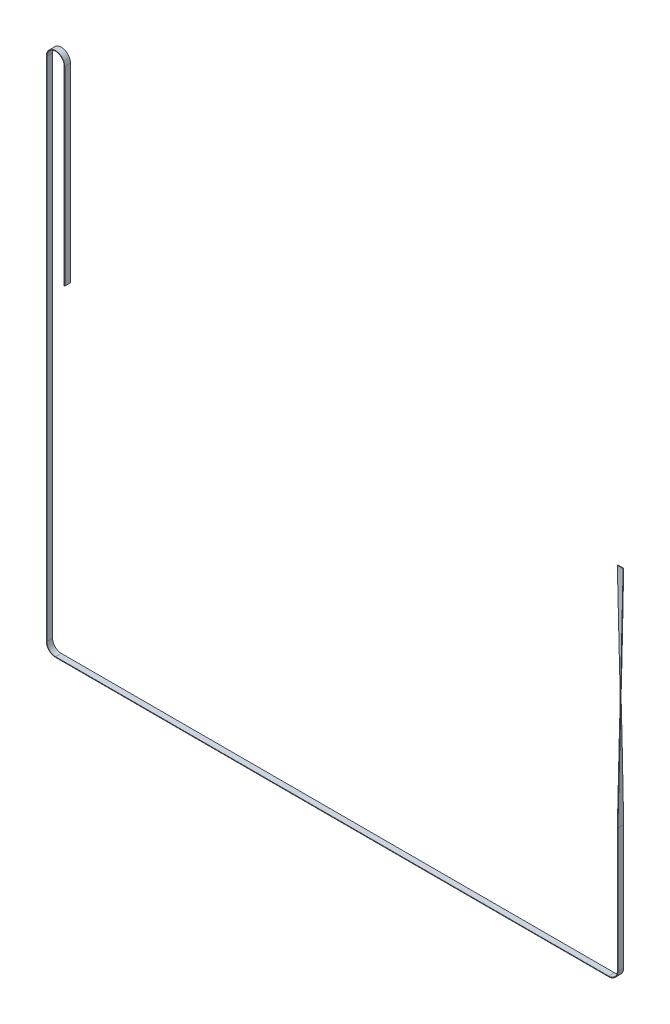
ISO-10303-21;
HEADER;
FILE_DESCRIPTION(('STEP AP214'),'2;1');
FILE_NAME('part.step','',(''),(''),'','','');
FILE_SCHEMA(('AUTOMOTIVE_DESIGN { 1 0 10303 214 1 1 1 1 }'));
ENDSEC;
DATA;
#1=APPLICATION_CONTEXT('core data for automotive mechanical design processes');
#2=APPLICATION_PROTOCOL_DEFINITION('international standard','automotive_design',2000,#1);
#3=PRODUCT_CONTEXT('',#1,'mechanical');
#4=PRODUCT('Part','Part','',(#3));
#5=PRODUCT_RELATED_PRODUCT_CATEGORY('part','',(#4));
#6=PRODUCT_DEFINITION_FORMATION('','',#4);
#7=PRODUCT_DEFINITION_CONTEXT('part definition',#1,'design');
#8=PRODUCT_DEFINITION('design','',#6,#7);
#9=PRODUCT_DEFINITION_SHAPE('','',#8);
#10=(LENGTH_UNIT() NAMED_UNIT(*) SI_UNIT(.MILLI.,.METRE.));
#11=(NAMED_UNIT(*) PLANE_ANGLE_UNIT() SI_UNIT($,.RADIAN.));
#12=(NAMED_UNIT(*) SI_UNIT($,.STERADIAN.) SOLID_ANGLE_UNIT());
#13=UNCERTAINTY_MEASURE_WITH_UNIT(LENGTH_MEASURE(1.E-05),#10,'distance_accuracy_value','');
#14=(GEOMETRIC_REPRESENTATION_CONTEXT(3) GLOBAL_UNCERTAINTY_ASSIGNED_CONTEXT((#13)) GLOBAL_UNIT_ASSIGNED_CONTEXT((#10,
#11,#12)) REPRESENTATION_CONTEXT('',''));
#15=CARTESIAN_POINT('',(0.,0.,0.));
#16=DIRECTION('',(0.,0.,1.));
#17=DIRECTION('',(1.,0.,0.));
#18=AXIS2_PLACEMENT_3D('',#15,#16,#17);
#19=CARTESIAN_POINT('',(-232.5,440.,2.5));
#20=DIRECTION('',(1.,0.,0.));
#21=DIRECTION('',(0.,1.,0.));
#22=AXIS2_PLACEMENT_3D('',#19,#20,#21);
#23=PLANE('',#22);
#24=DIRECTION('',(0.,-1.,0.));
#25=VECTOR('',#24,1.);
#26=CARTESIAN_POINT('',(-232.5,440.,-2.5));
#27=LINE('',#26,#25);
#28=CARTESIAN_POINT('',(-232.5,440.,-2.5));
#29=VERTEX_POINT('',#28);
#30=CARTESIAN_POINT('',(-232.5,275.,-2.5));
#31=VERTEX_POINT('',#30);
#32=EDGE_CURVE('E177',#29,#31,#27,.T.);
#33=ORIENTED_EDGE('',*,*,#32,.T.);
#34=DIRECTION('',(0.,0.,-1.));
#35=VECTOR('',#34,1.);
#36=CARTESIAN_POINT('',(-232.5,275.,2.5));
#37=LINE('',#36,#35);
#38=CARTESIAN_POINT('',(-232.5,275.,2.5));
#39=VERTEX_POINT('',#38);
#40=EDGE_CURVE('E11',#39,#31,#37,.T.);
#41=ORIENTED_EDGE('',*,*,#40,.F.);
#42=DIRECTION('',(0.,-1.,0.));
#43=VECTOR('',#42,1.);
#44=CARTESIAN_POINT('',(-232.5,440.,2.5));
#45=LINE('',#44,#43);
#46=CARTESIAN_POINT('',(-232.5,440.,2.5));
#47=VERTEX_POINT('',#46);
#48=EDGE_CURVE('E111',#47,#39,#45,.T.);
#49=ORIENTED_EDGE('',*,*,#48,.F.);
#50=DIRECTION('',(0.,0.,-1.));
#51=VECTOR('',#50,1.);
#52=CARTESIAN_POINT('',(-232.5,440.,2.5));
#53=LINE('',#52,#51);
#54=EDGE_CURVE('E173',#47,#29,#53,.T.);
#55=ORIENTED_EDGE('',*,*,#54,.T.);
#56=EDGE_LOOP('',(#33,#41,#49,#55));
#57=FACE_BOUND('',#56,.T.);
#58=ADVANCED_FACE('F33',(#57),#23,.F.);
#59=CARTESIAN_POINT('',(-232.,275.,2.5));
#60=DIRECTION('',(0.,-1.,0.));
#61=DIRECTION('',(0.,0.,-1.));
#62=AXIS2_PLACEMENT_3D('',#59,#60,#61);
#63=PLANE('',#62);
#64=DIRECTION('',(-1.,0.,0.));
#65=VECTOR('',#64,1.);
#66=CARTESIAN_POINT('',(-232.,275.,-2.5));
#67=LINE('',#66,#65);
#68=CARTESIAN_POINT('',(-232.,275.,-2.5));
#69=VERTEX_POINT('',#68);
#70=EDGE_CURVE('E180',#69,#31,#67,.T.);
#71=ORIENTED_EDGE('',*,*,#70,.F.);
#72=DIRECTION('',(0.,0.,-1.));
#73=VECTOR('',#72,1.);
#74=CARTESIAN_POINT('',(-232.,275.,2.5));
#75=LINE('',#74,#73);
#76=CARTESIAN_POINT('',(-232.,275.,2.5));
#77=VERTEX_POINT('',#76);
#78=EDGE_CURVE('E41',#77,#69,#75,.T.);
#79=ORIENTED_EDGE('',*,*,#78,.F.);
#80=DIRECTION('',(-1.,0.,0.));
#81=VECTOR('',#80,1.);
#82=CARTESIAN_POINT('',(-232.,275.,2.5));
#83=LINE('',#82,#81);
#84=EDGE_CURVE('E264',#77,#39,#83,.T.);
#85=ORIENTED_EDGE('',*,*,#84,.T.);
#86=ORIENTED_EDGE('',*,*,#40,.T.);
#87=EDGE_LOOP('',(#71,#79,#85,#86));
#88=FACE_BOUND('',#87,.T.);
#89=ADVANCED_FACE('F251',(#88),#63,.T.);
#90=CARTESIAN_POINT('',(-232.,440.,2.5));
#91=DIRECTION('',(1.,0.,0.));
#92=DIRECTION('',(0.,1.,0.));
#93=AXIS2_PLACEMENT_3D('',#90,#91,#92);
#94=PLANE('',#93);
#95=DIRECTION('',(0.,-1.,0.));
#96=VECTOR('',#95,1.);
#97=CARTESIAN_POINT('',(-232.,440.,-2.5));
#98=LINE('',#97,#96);
#99=CARTESIAN_POINT('',(-232.,440.,-2.5));
#100=VERTEX_POINT('',#99);
#101=EDGE_CURVE('E184',#100,#69,#98,.T.);
#102=ORIENTED_EDGE('',*,*,#101,.F.);
#103=DIRECTION('',(0.,0.,-1.));
#104=VECTOR('',#103,1.);
#105=CARTESIAN_POINT('',(-232.,440.,2.5));
#106=LINE('',#105,#104);
#107=CARTESIAN_POINT('',(-232.,440.,2.5));
#108=VERTEX_POINT('',#107);
#109=EDGE_CURVE('E241',#108,#100,#106,.T.);
#110=ORIENTED_EDGE('',*,*,#109,.F.);
#111=DIRECTION('',(0.,-1.,0.));
#112=VECTOR('',#111,1.);
#113=CARTESIAN_POINT('',(-232.,440.,2.5));
#114=LINE('',#113,#112);
#115=EDGE_CURVE('E248',#108,#77,#114,.T.);
#116=ORIENTED_EDGE('',*,*,#115,.T.);
#117=ORIENTED_EDGE('',*,*,#78,.T.);
#118=EDGE_LOOP('',(#102,#110,#116,#117));
#119=FACE_BOUND('',#118,.T.);
#120=ADVANCED_FACE('F246',(#119),#94,.T.);
#121=CARTESIAN_POINT('',(-240.,440.,2.5));
#122=DIRECTION('',(0.,0.,-1.));
#123=DIRECTION('',(-1.,0.,0.));
#124=AXIS2_PLACEMENT_3D('',#121,#122,#123);
#125=CYLINDRICAL_SURFACE('',#124,8.00000000000001);
#126=CARTESIAN_POINT('',(-240.,440.,-2.5));
#127=DIRECTION('',(0.,0.,1.));
#128=DIRECTION('',(1.,0.,0.));
#129=AXIS2_PLACEMENT_3D('',#126,#127,#128);
#130=CIRCLE('',#129,8.00000000000001);
#131=CARTESIAN_POINT('',(-248.,440.,-2.5));
#132=VERTEX_POINT('',#131);
#133=EDGE_CURVE('E187',#132,#100,#130,.F.);
#134=ORIENTED_EDGE('',*,*,#133,.F.);
#135=DIRECTION('',(0.,0.,-1.));
#136=VECTOR('',#135,1.);
#137=CARTESIAN_POINT('',(-248.,440.,2.5));
#138=LINE('',#137,#136);
#139=CARTESIAN_POINT('',(-248.,440.,2.5));
#140=VERTEX_POINT('',#139);
#141=EDGE_CURVE('E239',#140,#132,#138,.T.);
#142=ORIENTED_EDGE('',*,*,#141,.F.);
#143=CARTESIAN_POINT('',(-240.,440.,2.5));
#144=DIRECTION('',(0.,0.,1.));
#145=DIRECTION('',(1.,0.,0.));
#146=AXIS2_PLACEMENT_3D('',#143,#144,#145);
#147=CIRCLE('',#146,8.00000000000001);
#148=EDGE_CURVE('E261',#140,#108,#147,.F.);
#149=ORIENTED_EDGE('',*,*,#148,.T.);
#150=ORIENTED_EDGE('',*,*,#109,.T.);
#151=EDGE_LOOP('',(#134,#142,#149,#150));
#152=FACE_BOUND('',#151,.T.);
#153=ADVANCED_FACE('F258',(#152),#125,.T.);
#154=CARTESIAN_POINT('',(-248.,0.,2.5));
#155=DIRECTION('',(-1.,0.,0.));
#156=DIRECTION('',(0.,0.,1.));
#157=AXIS2_PLACEMENT_3D('',#154,#155,#156);
#158=PLANE('',#157);
#159=DIRECTION('',(0.,1.,0.));
#160=VECTOR('',#159,1.);
#161=CARTESIAN_POINT('',(-248.,0.,-2.5));
#162=LINE('',#161,#160);
#163=CARTESIAN_POINT('',(-248.,0.,-2.5));
#164=VERTEX_POINT('',#163);
#165=EDGE_CURVE('E190',#164,#132,#162,.T.);
#166=ORIENTED_EDGE('',*,*,#165,.F.);
#167=DIRECTION('',(0.,0.,-1.));
#168=VECTOR('',#167,1.);
#169=CARTESIAN_POINT('',(-248.,0.,2.5));
#170=LINE('',#169,#168);
#171=CARTESIAN_POINT('',(-248.,0.,2.5));
#172=VERTEX_POINT('',#171);
#173=EDGE_CURVE('E237',#172,#164,#170,.T.);
#174=ORIENTED_EDGE('',*,*,#173,.F.);
#175=DIRECTION('',(0.,1.,0.));
#176=VECTOR('',#175,1.);
#177=CARTESIAN_POINT('',(-248.,0.,2.5));
#178=LINE('',#177,#176);
#179=EDGE_CURVE('E266',#172,#140,#178,.T.);
#180=ORIENTED_EDGE('',*,*,#179,.T.);
#181=ORIENTED_EDGE('',*,*,#141,.T.);
#182=EDGE_LOOP('',(#166,#174,#180,#181));
#183=FACE_BOUND('',#182,.T.);
#184=ADVANCED_FACE('F322',(#183),#158,.T.);
#185=CARTESIAN_POINT('',(-240.,0.,2.5));
#186=DIRECTION('',(0.,0.,-1.));
#187=DIRECTION('',(-1.,0.,0.));
#188=AXIS2_PLACEMENT_3D('',#185,#186,#187);
#189=CYLINDRICAL_SURFACE('',#188,8.);
#190=CARTESIAN_POINT('',(-240.,0.,-2.5));
#191=DIRECTION('',(0.,0.,1.));
#192=DIRECTION('',(1.,0.,0.));
#193=AXIS2_PLACEMENT_3D('',#190,#191,#192);
#194=CIRCLE('',#193,8.);
#195=CARTESIAN_POINT('',(-240.,-8.00000000000002,-2.5));
#196=VERTEX_POINT('',#195);
#197=EDGE_CURVE('E193',#196,#164,#194,.F.);
#198=ORIENTED_EDGE('',*,*,#197,.F.);
#199=DIRECTION('',(0.,0.,-1.));
#200=VECTOR('',#199,1.);
#201=CARTESIAN_POINT('',(-240.,-8.00000000000002,2.5));
#202=LINE('',#201,#200);
#203=CARTESIAN_POINT('',(-240.,-8.00000000000002,2.5));
#204=VERTEX_POINT('',#203);
#205=EDGE_CURVE('E235',#204,#196,#202,.T.);
#206=ORIENTED_EDGE('',*,*,#205,.F.);
#207=CARTESIAN_POINT('',(-240.,0.,2.5));
#208=DIRECTION('',(0.,0.,1.));
#209=DIRECTION('',(1.,0.,0.));
#210=AXIS2_PLACEMENT_3D('',#207,#208,#209);
#211=CIRCLE('',#210,8.);
#212=EDGE_CURVE('E272',#204,#172,#211,.F.);
#213=ORIENTED_EDGE('',*,*,#212,.T.);
#214=ORIENTED_EDGE('',*,*,#173,.T.);
#215=EDGE_LOOP('',(#198,#206,#213,#214));
#216=FACE_BOUND('',#215,.T.);
#217=ADVANCED_FACE('F325',(#216),#189,.T.);
#218=CARTESIAN_POINT('',(240.,-8.00000000000001,2.5));
#219=DIRECTION('',(0.,-1.,0.));
#220=DIRECTION('',(0.,0.,-1.));
#221=AXIS2_PLACEMENT_3D('',#218,#219,#220);
#222=PLANE('',#221);
#223=DIRECTION('',(1.,0.,0.));
#224=VECTOR('',#223,1.);
#225=CARTESIAN_POINT('',(240.,-8.00000000000001,-2.5));
#226=LINE('',#225,#224);
#227=CARTESIAN_POINT('',(240.,-8.00000000000001,-2.5));
#228=VERTEX_POINT('',#227);
#229=EDGE_CURVE('E196',#228,#196,#226,.F.);
#230=ORIENTED_EDGE('',*,*,#229,.F.);
#231=DIRECTION('',(0.,0.,-1.));
#232=VECTOR('',#231,1.);
#233=CARTESIAN_POINT('',(240.,-8.00000000000001,2.5));
#234=LINE('',#233,#232);
#235=CARTESIAN_POINT('',(240.,-8.00000000000001,2.5));
#236=VERTEX_POINT('',#235);
#237=EDGE_CURVE('E233',#236,#228,#234,.T.);
#238=ORIENTED_EDGE('',*,*,#237,.F.);
#239=DIRECTION('',(1.,0.,0.));
#240=VECTOR('',#239,1.);
#241=CARTESIAN_POINT('',(240.,-8.00000000000001,2.5));
#242=LINE('',#241,#240);
#243=EDGE_CURVE('E275',#236,#204,#242,.F.);
#244=ORIENTED_EDGE('',*,*,#243,.T.);
#245=ORIENTED_EDGE('',*,*,#205,.T.);
#246=EDGE_LOOP('',(#230,#238,#244,#245));
#247=FACE_BOUND('',#246,.T.);
#248=ADVANCED_FACE('F329',(#247),#222,.T.);
#249=CARTESIAN_POINT('',(240.,0.,2.5));
#250=DIRECTION('',(0.,0.,-1.));
#251=DIRECTION('',(-1.,0.,0.));
#252=AXIS2_PLACEMENT_3D('',#249,#250,#251);
#253=CYLINDRICAL_SURFACE('',#252,8.00000000000004);
#254=CARTESIAN_POINT('',(240.,0.,-2.5));
#255=DIRECTION('',(0.,0.,1.));
#256=DIRECTION('',(1.,0.,0.));
#257=AXIS2_PLACEMENT_3D('',#254,#255,#256);
#258=CIRCLE('',#257,8.00000000000004);
#259=CARTESIAN_POINT('',(248.,0.,-2.5));
#260=VERTEX_POINT('',#259);
#261=EDGE_CURVE('E199',#260,#228,#258,.F.);
#262=ORIENTED_EDGE('',*,*,#261,.F.);
#263=DIRECTION('',(0.,0.,-1.));
#264=VECTOR('',#263,1.);
#265=CARTESIAN_POINT('',(248.,0.,2.5));
#266=LINE('',#265,#264);
#267=CARTESIAN_POINT('',(248.,0.,2.5));
#268=VERTEX_POINT('',#267);
#269=EDGE_CURVE('E231',#268,#260,#266,.T.);
#270=ORIENTED_EDGE('',*,*,#269,.F.);
#271=CARTESIAN_POINT('',(240.,0.,2.5));
#272=DIRECTION('',(0.,0.,1.));
#273=DIRECTION('',(1.,0.,0.));
#274=AXIS2_PLACEMENT_3D('',#271,#272,#273);
#275=CIRCLE('',#274,8.00000000000004);
#276=EDGE_CURVE('E278',#268,#236,#275,.F.);
#277=ORIENTED_EDGE('',*,*,#276,.T.);
#278=ORIENTED_EDGE('',*,*,#237,.T.);
#279=EDGE_LOOP('',(#262,#270,#277,#278));
#280=FACE_BOUND('',#279,.T.);
#281=ADVANCED_FACE('F333',(#280),#253,.T.);
#282=CARTESIAN_POINT('',(248.,0.,2.5));
#283=DIRECTION('',(1.,0.,0.));
#284=DIRECTION('',(0.,0.,-1.));
#285=AXIS2_PLACEMENT_3D('',#282,#283,#284);
#286=PLANE('',#285);
#287=DIRECTION('',(0.,1.,0.));
#288=VECTOR('',#287,1.);
#289=CARTESIAN_POINT('',(248.,0.,-2.5));
#290=LINE('',#289,#288);
#291=CARTESIAN_POINT('',(248.,107.723742787329,-2.5));
#292=VERTEX_POINT('',#291);
#293=EDGE_CURVE('E202',#292,#260,#290,.F.);
#294=ORIENTED_EDGE('',*,*,#293,.F.);
#295=DIRECTION('',(0.,0.,-1.));
#296=VECTOR('',#295,1.);
#297=CARTESIAN_POINT('',(248.,107.723742787329,2.5));
#298=LINE('',#297,#296);
#299=CARTESIAN_POINT('',(248.,107.723742787329,2.5));
#300=VERTEX_POINT('',#299);
#301=EDGE_CURVE('E228',#300,#292,#298,.T.);
#302=ORIENTED_EDGE('',*,*,#301,.F.);
#303=DIRECTION('',(0.,1.,0.));
#304=VECTOR('',#303,1.);
#305=CARTESIAN_POINT('',(248.,0.,2.5));
#306=LINE('',#305,#304);
#307=EDGE_CURVE('E281',#300,#268,#306,.F.);
#308=ORIENTED_EDGE('',*,*,#307,.T.);
#309=ORIENTED_EDGE('',*,*,#269,.T.);
#310=EDGE_LOOP('',(#294,#302,#308,#309));
#311=FACE_BOUND('',#310,.T.);
#312=ADVANCED_FACE('F337',(#311),#286,.T.);
#313=CARTESIAN_POINT('',(247.5,0.,2.5));
#314=DIRECTION('',(1.,0.,0.));
#315=DIRECTION('',(0.,0.,-1.));
#316=AXIS2_PLACEMENT_3D('',#313,#314,#315);
#317=PLANE('',#316);
#318=DIRECTION('',(0.,-1.,0.));
#319=VECTOR('',#318,1.);
#320=CARTESIAN_POINT('',(247.5,0.,-2.5));
#321=LINE('',#320,#319);
#322=CARTESIAN_POINT('',(247.5,107.723742787329,-2.5));
#323=VERTEX_POINT('',#322);
#324=CARTESIAN_POINT('',(247.5,0.,-2.5));
#325=VERTEX_POINT('',#324);
#326=EDGE_CURVE('E208',#323,#325,#321,.T.);
#327=ORIENTED_EDGE('',*,*,#326,.T.);
#328=DIRECTION('',(0.,0.,-1.));
#329=VECTOR('',#328,1.);
#330=CARTESIAN_POINT('',(247.5,0.,2.5));
#331=LINE('',#330,#329);
#332=CARTESIAN_POINT('',(247.5,0.,2.5));
#333=VERTEX_POINT('',#332);
#334=EDGE_CURVE('E223',#333,#325,#331,.T.);
#335=ORIENTED_EDGE('',*,*,#334,.F.);
#336=DIRECTION('',(0.,-1.,0.));
#337=VECTOR('',#336,1.);
#338=CARTESIAN_POINT('',(247.5,0.,2.5));
#339=LINE('',#338,#337);
#340=CARTESIAN_POINT('',(247.5,107.723742787329,2.5));
#341=VERTEX_POINT('',#340);
#342=EDGE_CURVE('E287',#341,#333,#339,.T.);
#343=ORIENTED_EDGE('',*,*,#342,.F.);
#344=DIRECTION('',(0.,0.,-1.));
#345=VECTOR('',#344,1.);
#346=CARTESIAN_POINT('',(247.5,107.723742787329,2.5));
#347=LINE('',#346,#345);
#348=EDGE_CURVE('E226',#341,#323,#347,.T.);
#349=ORIENTED_EDGE('',*,*,#348,.T.);
#350=EDGE_LOOP('',(#327,#335,#343,#349));
#351=FACE_BOUND('',#350,.T.);
#352=ADVANCED_FACE('F341',(#351),#317,.F.);
#353=CARTESIAN_POINT('',(240.,0.,2.5));
#354=DIRECTION('',(0.,0.,-1.));
#355=DIRECTION('',(-1.,0.,0.));
#356=AXIS2_PLACEMENT_3D('',#353,#354,#355);
#357=CYLINDRICAL_SURFACE('',#356,7.50000000000004);
#358=CARTESIAN_POINT('',(240.,0.,-2.5));
#359=DIRECTION('',(0.,0.,-1.));
#360=DIRECTION('',(-1.,0.,0.));
#361=AXIS2_PLACEMENT_3D('',#358,#359,#360);
#362=CIRCLE('',#361,7.50000000000004);
#363=CARTESIAN_POINT('',(240.,-7.50000000000001,-2.5));
#364=VERTEX_POINT('',#363);
#365=EDGE_CURVE('E210',#325,#364,#362,.T.);
#366=ORIENTED_EDGE('',*,*,#365,.T.);
#367=DIRECTION('',(0.,0.,-1.));
#368=VECTOR('',#367,1.);
#369=CARTESIAN_POINT('',(240.,-7.50000000000001,2.5));
#370=LINE('',#369,#368);
#371=CARTESIAN_POINT('',(240.,-7.50000000000001,2.5));
#372=VERTEX_POINT('',#371);
#373=EDGE_CURVE('E220',#372,#364,#370,.T.);
#374=ORIENTED_EDGE('',*,*,#373,.F.);
#375=CARTESIAN_POINT('',(240.,0.,2.5));
#376=DIRECTION('',(0.,0.,-1.));
#377=DIRECTION('',(-1.,0.,0.));
#378=AXIS2_PLACEMENT_3D('',#375,#376,#377);
#379=CIRCLE('',#378,7.50000000000004);
#380=EDGE_CURVE('E289',#333,#372,#379,.T.);
#381=ORIENTED_EDGE('',*,*,#380,.F.);
#382=ORIENTED_EDGE('',*,*,#334,.T.);
#383=EDGE_LOOP('',(#366,#374,#381,#382));
#384=FACE_BOUND('',#383,.T.);
#385=ADVANCED_FACE('F295',(#384),#357,.F.);
#386=CARTESIAN_POINT('',(240.,-7.50000000000001,2.5));
#387=DIRECTION('',(0.,-1.,0.));
#388=DIRECTION('',(0.,0.,-1.));
#389=AXIS2_PLACEMENT_3D('',#386,#387,#388);
#390=PLANE('',#389);
#391=DIRECTION('',(-1.,0.,0.));
#392=VECTOR('',#391,1.);
#393=CARTESIAN_POINT('',(240.,-7.50000000000001,-2.5));
#394=LINE('',#393,#392);
#395=CARTESIAN_POINT('',(-240.,-7.50000000000002,-2.5));
#396=VERTEX_POINT('',#395);
#397=EDGE_CURVE('E212',#364,#396,#394,.T.);
#398=ORIENTED_EDGE('',*,*,#397,.T.);
#399=DIRECTION('',(0.,0.,-1.));
#400=VECTOR('',#399,1.);
#401=CARTESIAN_POINT('',(-240.,-7.50000000000002,2.5));
#402=LINE('',#401,#400);
#403=CARTESIAN_POINT('',(-240.,-7.50000000000002,2.5));
#404=VERTEX_POINT('',#403);
#405=EDGE_CURVE('E168',#404,#396,#402,.T.);
#406=ORIENTED_EDGE('',*,*,#405,.F.);
#407=DIRECTION('',(-1.,0.,0.));
#408=VECTOR('',#407,1.);
#409=CARTESIAN_POINT('',(240.,-7.50000000000001,2.5));
#410=LINE('',#409,#408);
#411=EDGE_CURVE('E159',#372,#404,#410,.T.);
#412=ORIENTED_EDGE('',*,*,#411,.F.);
#413=ORIENTED_EDGE('',*,*,#373,.T.);
#414=EDGE_LOOP('',(#398,#406,#412,#413));
#415=FACE_BOUND('',#414,.T.);
#416=ADVANCED_FACE('F299',(#415),#390,.F.);
#417=CARTESIAN_POINT('',(-240.,0.,2.5));
#418=DIRECTION('',(0.,0.,-1.));
#419=DIRECTION('',(-1.,0.,0.));
#420=AXIS2_PLACEMENT_3D('',#417,#418,#419);
#421=CYLINDRICAL_SURFACE('',#420,7.5);
#422=CARTESIAN_POINT('',(-240.,0.,-2.5));
#423=DIRECTION('',(0.,0.,-1.));
#424=DIRECTION('',(1.,0.,0.));
#425=AXIS2_PLACEMENT_3D('',#422,#423,#424);
#426=CIRCLE('',#425,7.5);
#427=CARTESIAN_POINT('',(-247.5,0.,-2.5));
#428=VERTEX_POINT('',#427);
#429=EDGE_CURVE('E167',#396,#428,#426,.T.);
#430=ORIENTED_EDGE('',*,*,#429,.T.);
#431=DIRECTION('',(0.,0.,-1.));
#432=VECTOR('',#431,1.);
#433=CARTESIAN_POINT('',(-247.5,0.,2.5));
#434=LINE('',#433,#432);
#435=CARTESIAN_POINT('',(-247.5,0.,2.5));
#436=VERTEX_POINT('',#435);
#437=EDGE_CURVE('E164',#436,#428,#434,.T.);
#438=ORIENTED_EDGE('',*,*,#437,.F.);
#439=CARTESIAN_POINT('',(-240.,0.,2.5));
#440=DIRECTION('',(0.,0.,-1.));
#441=DIRECTION('',(1.,0.,0.));
#442=AXIS2_PLACEMENT_3D('',#439,#440,#441);
#443=CIRCLE('',#442,7.5);
#444=EDGE_CURVE('E153',#404,#436,#443,.T.);
#445=ORIENTED_EDGE('',*,*,#444,.F.);
#446=ORIENTED_EDGE('',*,*,#405,.T.);
#447=EDGE_LOOP('',(#430,#438,#445,#446));
#448=FACE_BOUND('',#447,.T.);
#449=ADVANCED_FACE('F165',(#448),#421,.F.);
#450=CARTESIAN_POINT('',(-247.5,0.,2.5));
#451=DIRECTION('',(-1.,0.,0.));
#452=DIRECTION('',(0.,0.,1.));
#453=AXIS2_PLACEMENT_3D('',#450,#451,#452);
#454=PLANE('',#453);
#455=DIRECTION('',(0.,1.,0.));
#456=VECTOR('',#455,1.);
#457=CARTESIAN_POINT('',(-247.5,0.,-2.5));
#458=LINE('',#457,#456);
#459=CARTESIAN_POINT('',(-247.5,440.,-2.5));
#460=VERTEX_POINT('',#459);
#461=EDGE_CURVE('E99',#428,#460,#458,.T.);
#462=ORIENTED_EDGE('',*,*,#461,.T.);
#463=DIRECTION('',(0.,0.,-1.));
#464=VECTOR('',#463,1.);
#465=CARTESIAN_POINT('',(-247.5,440.,2.5));
#466=LINE('',#465,#464);
#467=CARTESIAN_POINT('',(-247.5,440.,2.5));
#468=VERTEX_POINT('',#467);
#469=EDGE_CURVE('E169',#468,#460,#466,.T.);
#470=ORIENTED_EDGE('',*,*,#469,.F.);
#471=DIRECTION('',(0.,1.,0.));
#472=VECTOR('',#471,1.);
#473=CARTESIAN_POINT('',(-247.5,0.,2.5));
#474=LINE('',#473,#472);
#475=EDGE_CURVE('E157',#436,#468,#474,.T.);
#476=ORIENTED_EDGE('',*,*,#475,.F.);
#477=ORIENTED_EDGE('',*,*,#437,.T.);
#478=EDGE_LOOP('',(#462,#470,#476,#477));
#479=FACE_BOUND('',#478,.T.);
#480=ADVANCED_FACE('F171',(#479),#454,.F.);
#481=CARTESIAN_POINT('',(-240.,440.,2.5));
#482=DIRECTION('',(0.,0.,-1.));
#483=DIRECTION('',(-1.,0.,0.));
#484=AXIS2_PLACEMENT_3D('',#481,#482,#483);
#485=CYLINDRICAL_SURFACE('',#484,7.50000000000001);
#486=CARTESIAN_POINT('',(-240.,440.,-2.5));
#487=DIRECTION('',(0.,0.,-1.));
#488=DIRECTION('',(1.,0.,0.));
#489=AXIS2_PLACEMENT_3D('',#486,#487,#488);
#490=CIRCLE('',#489,7.50000000000001);
#491=EDGE_CURVE('E105',#460,#29,#490,.T.);
#492=ORIENTED_EDGE('',*,*,#491,.T.);
#493=ORIENTED_EDGE('',*,*,#54,.F.);
#494=CARTESIAN_POINT('',(-240.,440.,2.5));
#495=DIRECTION('',(0.,0.,-1.));
#496=DIRECTION('',(1.,0.,0.));
#497=AXIS2_PLACEMENT_3D('',#494,#495,#496);
#498=CIRCLE('',#497,7.50000000000001);
#499=EDGE_CURVE('E49',#468,#47,#498,.T.);
#500=ORIENTED_EDGE('',*,*,#499,.F.);
#501=ORIENTED_EDGE('',*,*,#469,.T.);
#502=EDGE_LOOP('',(#492,#493,#500,#501));
#503=FACE_BOUND('',#502,.T.);
#504=ADVANCED_FACE('F301',(#503),#485,.F.);
#505=CARTESIAN_POINT('',(-240.,440.,2.5));
#506=DIRECTION('',(0.,0.,1.));
#507=DIRECTION('',(1.,0.,0.));
#508=AXIS2_PLACEMENT_3D('',#505,#506,#507);
#509=PLANE('',#508);
#510=ORIENTED_EDGE('',*,*,#48,.T.);
#511=ORIENTED_EDGE('',*,*,#84,.F.);
#512=ORIENTED_EDGE('',*,*,#115,.F.);
#513=ORIENTED_EDGE('',*,*,#148,.F.);
#514=ORIENTED_EDGE('',*,*,#179,.F.);
#515=ORIENTED_EDGE('',*,*,#212,.F.);
#516=ORIENTED_EDGE('',*,*,#243,.F.);
#517=ORIENTED_EDGE('',*,*,#276,.F.);
#518=ORIENTED_EDGE('',*,*,#307,.F.);
#519=DIRECTION('',(1.,0.,0.));
#520=VECTOR('',#519,1.);
#521=CARTESIAN_POINT('',(247.5,107.723742787329,2.5));
#522=LINE('',#521,#520);
#523=EDGE_CURVE('E284',#341,#300,#522,.T.);
#524=ORIENTED_EDGE('',*,*,#523,.F.);
#525=ORIENTED_EDGE('',*,*,#342,.T.);
#526=ORIENTED_EDGE('',*,*,#380,.T.);
#527=ORIENTED_EDGE('',*,*,#411,.T.);
#528=ORIENTED_EDGE('',*,*,#444,.T.);
#529=ORIENTED_EDGE('',*,*,#475,.T.);
#530=ORIENTED_EDGE('',*,*,#499,.T.);
#531=EDGE_LOOP('',(#510,#511,#512,#513,#514,#515,#516,#517,#518,#524,#525,#526,#527,#528,#529,#530));
#532=FACE_BOUND('',#531,.T.);
#533=ADVANCED_FACE('F155',(#532),#509,.T.);
#534=CARTESIAN_POINT('',(-240.,440.,-2.5));
#535=DIRECTION('',(0.,0.,1.));
#536=DIRECTION('',(1.,0.,0.));
#537=AXIS2_PLACEMENT_3D('',#534,#535,#536);
#538=PLANE('',#537);
#539=ORIENTED_EDGE('',*,*,#32,.F.);
#540=ORIENTED_EDGE('',*,*,#491,.F.);
#541=ORIENTED_EDGE('',*,*,#461,.F.);
#542=ORIENTED_EDGE('',*,*,#429,.F.);
#543=ORIENTED_EDGE('',*,*,#397,.F.);
#544=ORIENTED_EDGE('',*,*,#365,.F.);
#545=ORIENTED_EDGE('',*,*,#326,.F.);
#546=DIRECTION('',(1.,0.,0.));
#547=VECTOR('',#546,1.);
#548=CARTESIAN_POINT('',(247.5,107.723742787329,-2.5));
#549=LINE('',#548,#547);
#550=EDGE_CURVE('E205',#323,#292,#549,.T.);
#551=ORIENTED_EDGE('',*,*,#550,.T.);
#552=ORIENTED_EDGE('',*,*,#293,.T.);
#553=ORIENTED_EDGE('',*,*,#261,.T.);
#554=ORIENTED_EDGE('',*,*,#229,.T.);
#555=ORIENTED_EDGE('',*,*,#197,.T.);
#556=ORIENTED_EDGE('',*,*,#165,.T.);
#557=ORIENTED_EDGE('',*,*,#133,.T.);
#558=ORIENTED_EDGE('',*,*,#101,.T.);
#559=ORIENTED_EDGE('',*,*,#70,.T.);
#560=EDGE_LOOP('',(#539,#540,#541,#542,#543,#544,#545,#551,#552,#553,#554,#555,#556,#557,#558,#559));
#561=FACE_BOUND('',#560,.T.);
#562=ADVANCED_FACE('F254',(#561),#538,.F.);
#563=CARTESIAN_POINT('',(245.,302.459613800316,-0.5));
#564=DIRECTION('',(0.,1.,0.));
#565=DIRECTION('',(1.,0.,0.));
#566=AXIS2_PLACEMENT_3D('',#563,#564,#565);
#567=PLANE('',#566);
#568=DIRECTION('',(-1.,0.,0.));
#569=VECTOR('',#568,1.);
#570=CARTESIAN_POINT('',(250.,302.459613800316,-0.5));
#571=LINE('',#570,#569);
#572=CARTESIAN_POINT('',(250.,302.459613800316,-0.5));
#573=VERTEX_POINT('',#572);
#574=CARTESIAN_POINT('',(245.,302.459613800316,-0.499999999999995));
#575=VERTEX_POINT('',#574);
#576=EDGE_CURVE('E480',#573,#575,#571,.T.);
#577=ORIENTED_EDGE('',*,*,#576,.T.);
#578=DIRECTION('',(0.,0.,1.));
#579=VECTOR('',#578,1.);
#580=CARTESIAN_POINT('',(245.,302.459613800316,-0.5));
#581=LINE('',#580,#579);
#582=CARTESIAN_POINT('',(245.,302.459613800316,0.));
#583=VERTEX_POINT('',#582);
#584=EDGE_CURVE('E478',#575,#583,#581,.T.);
#585=ORIENTED_EDGE('',*,*,#584,.T.);
#586=DIRECTION('',(1.,0.,0.));
#587=VECTOR('',#586,1.);
#588=CARTESIAN_POINT('',(245.,302.459613800316,0.));
#589=LINE('',#588,#587);
#590=CARTESIAN_POINT('',(250.,302.459613800316,0.));
#591=VERTEX_POINT('',#590);
#592=EDGE_CURVE('E490',#583,#591,#589,.T.);
#593=ORIENTED_EDGE('',*,*,#592,.T.);
#594=DIRECTION('',(0.,0.,-1.));
#595=VECTOR('',#594,1.);
#596=CARTESIAN_POINT('',(250.,302.459613800316,0.));
#597=LINE('',#596,#595);
#598=EDGE_CURVE('E181',#591,#573,#597,.T.);
#599=ORIENTED_EDGE('',*,*,#598,.T.);
#600=EDGE_LOOP('',(#577,#585,#593,#599));
#601=FACE_BOUND('',#600,.T.);
#602=ADVANCED_FACE('F392',(#601),#567,.T.);
#603=CARTESIAN_POINT('',(248.,107.723742787329,2.5));
#604=CARTESIAN_POINT('',(248.246228508393,119.89473472564,2.45075429832142));
#605=CARTESIAN_POINT('',(248.478118445242,132.065726663952,2.35441804000001));
#606=CARTESIAN_POINT('',(248.710008382091,144.236718602264,2.25808178167861));
#607=CARTESIAN_POINT('',(248.918648347168,156.407710540575,2.11835711509567));
#608=CARTESIAN_POINT('',(249.127288312246,168.578702478887,1.97863244851274));
#609=CARTESIAN_POINT('',(249.3046603887,180.749694417199,1.80088891424656));
#610=CARTESIAN_POINT('',(249.482032465155,192.92068635551,1.62314537998039));
#611=CARTESIAN_POINT('',(249.62132034356,205.091678293822,1.41421356237309));
#612=CARTESIAN_POINT('',(249.760608221965,217.262670232134,1.2052817447658));
#613=CARTESIAN_POINT('',(249.856459147266,229.433662170445,0.973190776397733));
#614=CARTESIAN_POINT('',(249.952310072568,241.604654108757,0.741099808029662));
#615=CARTESIAN_POINT('',(250.001040547461,253.775646047069,0.494768814657081));
#616=CARTESIAN_POINT('',(250.049771022354,265.946637985381,0.2484378212845));
#617=CARTESIAN_POINT('',(250.049508362016,278.117629923692,-0.00266683516129469));
#618=CARTESIAN_POINT('',(250.049245701679,290.288621862004,-0.253771491607089));
#619=CARTESIAN_POINT('',(250.,302.459613800316,-0.5));
#620=CARTESIAN_POINT('',(248.,107.723742787329,-2.5));
#621=CARTESIAN_POINT('',(247.753771491607,119.89473472564,-2.54924570167858));
#622=CARTESIAN_POINT('',(247.502666835161,132.065726663952,-2.54950836201614));
#623=CARTESIAN_POINT('',(247.251562178715,144.236718602264,-2.5497710223537));
#624=CARTESIAN_POINT('',(247.005231185343,156.407710540575,-2.50104054746076));
#625=CARTESIAN_POINT('',(246.75890019197,168.578702478887,-2.45231007256783));
#626=CARTESIAN_POINT('',(246.526809223602,180.749694417199,-2.35645914726616));
#627=CARTESIAN_POINT('',(246.294718255234,192.92068635551,-2.2606082219645));
#628=CARTESIAN_POINT('',(246.085786437627,205.091678293822,-2.12132034355964));
#629=CARTESIAN_POINT('',(245.87685462002,217.262670232134,-1.98203246515478));
#630=CARTESIAN_POINT('',(245.699111085753,229.433662170445,-1.80466038870028));
#631=CARTESIAN_POINT('',(245.521367551487,241.604654108757,-1.62728831224578));
#632=CARTESIAN_POINT('',(245.381642884904,253.775646047069,-1.41864834716837));
#633=CARTESIAN_POINT('',(245.241918218321,265.946637985381,-1.21000838209096));
#634=CARTESIAN_POINT('',(245.14558196,278.117629923692,-0.978118445241936));
#635=CARTESIAN_POINT('',(245.049245701679,290.288621862004,-0.746228508392911));
#636=CARTESIAN_POINT('',(245.,302.459613800316,-0.5));
#637=(BOUNDED_SURFACE() B_SPLINE_SURFACE(1,2,((#603,#604,#605,#606,#607,#608,#609,#610,#611,
#612,#613,#614,#615,#616,#617,#618,#619),(#620,#621,#622,#623,#624,#625,#626,#627,#628,#629,
#630,#631,#632,#633,#634,#635,#636)),.UNSPECIFIED.,.F.,.F.,.F.) B_SPLINE_SURFACE_WITH_KNOTS((2,
2),(3,2,2,2,2,2,2,2,3),(0.,1.),(0.,0.125,0.25,0.375,0.5,0.625,0.75,0.875,1.),
.UNSPECIFIED.) GEOMETRIC_REPRESENTATION_ITEM() RATIONAL_B_SPLINE_SURFACE(((1.,0.995184726672197,
1.,0.995184726672197,1.,0.995184726672197,1.,0.995184726672197,1.,0.995184726672197,1.,
0.995184726672197,1.,0.995184726672197,1.,0.995184726672197,1.),(1.,0.995184726672197,1.,
0.995184726672197,1.,0.995184726672197,1.,0.995184726672197,1.,0.995184726672197,1.,
0.995184726672197,1.,0.995184726672197,1.,0.995184726672197,1.))) REPRESENTATION_ITEM('') SURFACE());
#638=CARTESIAN_POINT('',(248.,107.723742787329,-2.5));
#639=CARTESIAN_POINT('',(247.753771491607,119.89473472564,-2.54924570167858));
#640=CARTESIAN_POINT('',(247.502666835161,132.065726663952,-2.54950836201614));
#641=CARTESIAN_POINT('',(247.251562178715,144.236718602264,-2.5497710223537));
#642=CARTESIAN_POINT('',(247.005231185343,156.407710540575,-2.50104054746076));
#643=CARTESIAN_POINT('',(246.75890019197,168.578702478887,-2.45231007256783));
#644=CARTESIAN_POINT('',(246.526809223602,180.749694417199,-2.35645914726616));
#645=CARTESIAN_POINT('',(246.294718255234,192.92068635551,-2.2606082219645));
#646=CARTESIAN_POINT('',(246.085786437627,205.091678293822,-2.12132034355964));
#647=CARTESIAN_POINT('',(245.87685462002,217.262670232134,-1.98203246515478));
#648=CARTESIAN_POINT('',(245.699111085753,229.433662170445,-1.80466038870028));
#649=CARTESIAN_POINT('',(245.521367551487,241.604654108757,-1.62728831224578));
#650=CARTESIAN_POINT('',(245.381642884904,253.775646047069,-1.41864834716837));
#651=CARTESIAN_POINT('',(245.241918218321,265.946637985381,-1.21000838209096));
#652=CARTESIAN_POINT('',(245.14558196,278.117629923692,-0.978118445241936));
#653=CARTESIAN_POINT('',(245.049245701679,290.288621862004,-0.746228508392911));
#654=CARTESIAN_POINT('',(245.,302.459613800316,-0.5));
#655=(BOUNDED_CURVE() B_SPLINE_CURVE(2,(#638,#639,#640,#641,#642,#643,#644,#645,#646,#647,#648,
#649,#650,#651,#652,#653,#654),.UNSPECIFIED.,.F.,.F.) B_SPLINE_CURVE_WITH_KNOTS((3,2,2,2,2,2,2,
2,3),(0.,0.125,0.25,0.375,0.5,0.625,0.75,0.875,1.),
.UNSPECIFIED.) CURVE() GEOMETRIC_REPRESENTATION_ITEM() RATIONAL_B_SPLINE_CURVE((1.,
0.995184726672197,1.,0.995184726672197,1.,0.995184726672197,1.,0.995184726672197,1.,
0.995184726672197,1.,0.995184726672197,1.,0.995184726672197,1.,0.995184726672197,1.)) REPRESENTATION_ITEM(''));
#656=EDGE_CURVE('E483',#292,#575,#655,.T.);
#657=CARTESIAN_POINT('',(248.,107.723742787329,2.5));
#658=CARTESIAN_POINT('',(248.246228508393,119.89473472564,2.45075429832142));
#659=CARTESIAN_POINT('',(248.478118445242,132.065726663952,2.35441804000001));
#660=CARTESIAN_POINT('',(248.710008382091,144.236718602264,2.25808178167861));
#661=CARTESIAN_POINT('',(248.918648347168,156.407710540575,2.11835711509567));
#662=CARTESIAN_POINT('',(249.127288312246,168.578702478887,1.97863244851274));
#663=CARTESIAN_POINT('',(249.3046603887,180.749694417199,1.80088891424656));
#664=CARTESIAN_POINT('',(249.482032465155,192.92068635551,1.62314537998039));
#665=CARTESIAN_POINT('',(249.62132034356,205.091678293822,1.41421356237309));
#666=CARTESIAN_POINT('',(249.760608221965,217.262670232134,1.2052817447658));
#667=CARTESIAN_POINT('',(249.856459147266,229.433662170445,0.973190776397733));
#668=CARTESIAN_POINT('',(249.952310072568,241.604654108757,0.741099808029662));
#669=CARTESIAN_POINT('',(250.001040547461,253.775646047069,0.494768814657081));
#670=CARTESIAN_POINT('',(250.049771022354,265.946637985381,0.2484378212845));
#671=CARTESIAN_POINT('',(250.049508362016,278.117629923692,-0.00266683516129469));
#672=CARTESIAN_POINT('',(250.049245701679,290.288621862004,-0.253771491607089));
#673=CARTESIAN_POINT('',(250.,302.459613800316,-0.5));
#674=(BOUNDED_CURVE() B_SPLINE_CURVE(2,(#657,#658,#659,#660,#661,#662,#663,#664,#665,#666,#667,
#668,#669,#670,#671,#672,#673),.UNSPECIFIED.,.F.,.F.) B_SPLINE_CURVE_WITH_KNOTS((3,2,2,2,2,2,2,
2,3),(0.,0.125,0.25,0.375,0.5,0.625,0.75,0.875,1.),
.UNSPECIFIED.) CURVE() GEOMETRIC_REPRESENTATION_ITEM() RATIONAL_B_SPLINE_CURVE((1.,
0.995184726672197,1.,0.995184726672197,1.,0.995184726672197,1.,0.995184726672197,1.,
0.995184726672197,1.,0.995184726672197,1.,0.995184726672197,1.,0.995184726672197,1.)) REPRESENTATION_ITEM(''));
#675=EDGE_CURVE('E484',#300,#573,#674,.T.);
#676=ORIENTED_EDGE('',*,*,#656,.T.);
#677=ORIENTED_EDGE('',*,*,#576,.F.);
#678=ORIENTED_EDGE('',*,*,#675,.F.);
#679=ORIENTED_EDGE('',*,*,#301,.T.);
#680=EDGE_LOOP('',(#676,#677,#678,#679));
#681=FACE_BOUND('',#680,.T.);
#682=ADVANCED_FACE('F401',(#681),#637,.T.);
#683=CARTESIAN_POINT('',(248.,107.723742787329,-2.5));
#684=CARTESIAN_POINT('',(247.753771491607,119.89473472564,-2.54924570167858));
#685=CARTESIAN_POINT('',(247.502666835161,132.065726663952,-2.54950836201614));
#686=CARTESIAN_POINT('',(247.251562178715,144.236718602264,-2.5497710223537));
#687=CARTESIAN_POINT('',(247.005231185343,156.407710540575,-2.50104054746076));
#688=CARTESIAN_POINT('',(246.75890019197,168.578702478887,-2.45231007256783));
#689=CARTESIAN_POINT('',(246.526809223602,180.749694417199,-2.35645914726616));
#690=CARTESIAN_POINT('',(246.294718255234,192.92068635551,-2.2606082219645));
#691=CARTESIAN_POINT('',(246.085786437627,205.091678293822,-2.12132034355964));
#692=CARTESIAN_POINT('',(245.87685462002,217.262670232134,-1.98203246515478));
#693=CARTESIAN_POINT('',(245.699111085753,229.433662170445,-1.80466038870028));
#694=CARTESIAN_POINT('',(245.521367551487,241.604654108757,-1.62728831224578));
#695=CARTESIAN_POINT('',(245.381642884904,253.775646047069,-1.41864834716837));
#696=CARTESIAN_POINT('',(245.241918218321,265.946637985381,-1.21000838209096));
#697=CARTESIAN_POINT('',(245.14558196,278.117629923692,-0.978118445241936));
#698=CARTESIAN_POINT('',(245.049245701679,290.288621862004,-0.746228508392911));
#699=CARTESIAN_POINT('',(245.,302.459613800316,-0.5));
#700=CARTESIAN_POINT('',(247.5,107.723742787329,-2.5));
#701=CARTESIAN_POINT('',(247.253771491607,119.89473472564,-2.5));
#702=CARTESIAN_POINT('',(247.01227419496,132.065726663952,-2.45196320100808));
#703=CARTESIAN_POINT('',(246.770776898312,144.236718602264,-2.40392640201615));
#704=CARTESIAN_POINT('',(246.543291419087,156.407710540575,-2.30969883127822));
#705=CARTESIAN_POINT('',(246.315805939862,168.578702478887,-2.21547126054028));
#706=CARTESIAN_POINT('',(246.111074417451,180.749694417199,-2.07867403075636));
#707=CARTESIAN_POINT('',(245.90634289504,192.92068635551,-1.94187680097244));
#708=CARTESIAN_POINT('',(245.732233047034,205.091678293822,-1.76776695296637));
#709=CARTESIAN_POINT('',(245.558123199028,217.262670232134,-1.59365710496029));
#710=CARTESIAN_POINT('',(245.421325969244,229.433662170445,-1.38892558254901));
#711=CARTESIAN_POINT('',(245.28452873946,241.604654108757,-1.18419406013772));
#712=CARTESIAN_POINT('',(245.190301168722,253.775646047069,-0.956708580912725));
#713=CARTESIAN_POINT('',(245.096073597984,265.946637985381,-0.729223101687731));
#714=CARTESIAN_POINT('',(245.048036798992,278.117629923692,-0.487725805040321));
#715=CARTESIAN_POINT('',(245.,290.288621862004,-0.246228508392911));
#716=CARTESIAN_POINT('',(245.,302.459613800316,0.));
#717=(BOUNDED_SURFACE() B_SPLINE_SURFACE(1,2,((#683,#684,#685,#686,#687,#688,#689,#690,#691,
#692,#693,#694,#695,#696,#697,#698,#699),(#700,#701,#702,#703,#704,#705,#706,#707,#708,#709,
#710,#711,#712,#713,#714,#715,#716)),.UNSPECIFIED.,.F.,.F.,.F.) B_SPLINE_SURFACE_WITH_KNOTS((2,
2),(3,2,2,2,2,2,2,2,3),(0.,1.),(0.,0.125,0.25,0.375,0.5,0.625,0.75,0.875,1.),
.UNSPECIFIED.) GEOMETRIC_REPRESENTATION_ITEM() RATIONAL_B_SPLINE_SURFACE(((1.,0.995184726672197,
1.,0.995184726672197,1.,0.995184726672197,1.,0.995184726672197,1.,0.995184726672197,1.,
0.995184726672197,1.,0.995184726672197,1.,0.995184726672197,1.),(1.,0.995184726672197,1.,
0.995184726672197,1.,0.995184726672197,1.,0.995184726672197,1.,0.995184726672197,1.,
0.995184726672197,1.,0.995184726672197,1.,0.995184726672197,1.))) REPRESENTATION_ITEM('') SURFACE());
#718=CARTESIAN_POINT('',(247.5,107.723742787329,-2.5));
#719=CARTESIAN_POINT('',(247.253771491607,119.89473472564,-2.5));
#720=CARTESIAN_POINT('',(247.01227419496,132.065726663952,-2.45196320100808));
#721=CARTESIAN_POINT('',(246.770776898312,144.236718602264,-2.40392640201615));
#722=CARTESIAN_POINT('',(246.543291419087,156.407710540575,-2.30969883127822));
#723=CARTESIAN_POINT('',(246.315805939862,168.578702478887,-2.21547126054028));
#724=CARTESIAN_POINT('',(246.111074417451,180.749694417199,-2.07867403075636));
#725=CARTESIAN_POINT('',(245.90634289504,192.92068635551,-1.94187680097244));
#726=CARTESIAN_POINT('',(245.732233047034,205.091678293822,-1.76776695296637));
#727=CARTESIAN_POINT('',(245.558123199028,217.262670232134,-1.59365710496029));
#728=CARTESIAN_POINT('',(245.421325969244,229.433662170445,-1.38892558254901));
#729=CARTESIAN_POINT('',(245.28452873946,241.604654108757,-1.18419406013772));
#730=CARTESIAN_POINT('',(245.190301168722,253.775646047069,-0.956708580912725));
#731=CARTESIAN_POINT('',(245.096073597984,265.946637985381,-0.729223101687731));
#732=CARTESIAN_POINT('',(245.048036798992,278.117629923692,-0.487725805040321));
#733=CARTESIAN_POINT('',(245.,290.288621862004,-0.246228508392911));
#734=CARTESIAN_POINT('',(245.,302.459613800316,0.));
#735=(BOUNDED_CURVE() B_SPLINE_CURVE(2,(#718,#719,#720,#721,#722,#723,#724,#725,#726,#727,#728,
#729,#730,#731,#732,#733,#734),.UNSPECIFIED.,.F.,.F.) B_SPLINE_CURVE_WITH_KNOTS((3,2,2,2,2,2,2,
2,3),(0.,0.125,0.25,0.375,0.5,0.625,0.75,0.875,1.),
.UNSPECIFIED.) CURVE() GEOMETRIC_REPRESENTATION_ITEM() RATIONAL_B_SPLINE_CURVE((1.,
0.995184726672197,1.,0.995184726672197,1.,0.995184726672197,1.,0.995184726672197,1.,
0.995184726672197,1.,0.995184726672197,1.,0.995184726672197,1.,0.995184726672197,1.)) REPRESENTATION_ITEM(''));
#736=EDGE_CURVE('E495',#323,#583,#735,.T.);
#737=ORIENTED_EDGE('',*,*,#736,.T.);
#738=ORIENTED_EDGE('',*,*,#584,.F.);
#739=ORIENTED_EDGE('',*,*,#656,.F.);
#740=ORIENTED_EDGE('',*,*,#550,.F.);
#741=EDGE_LOOP('',(#737,#738,#739,#740));
#742=FACE_BOUND('',#741,.T.);
#743=ADVANCED_FACE('F411',(#742),#717,.T.);
#744=CARTESIAN_POINT('',(247.5,107.723742787329,-2.5));
#745=CARTESIAN_POINT('',(247.253771491607,119.89473472564,-2.5));
#746=CARTESIAN_POINT('',(247.01227419496,132.065726663952,-2.45196320100808));
#747=CARTESIAN_POINT('',(246.770776898312,144.236718602264,-2.40392640201615));
#748=CARTESIAN_POINT('',(246.543291419087,156.407710540575,-2.30969883127822));
#749=CARTESIAN_POINT('',(246.315805939862,168.578702478887,-2.21547126054028));
#750=CARTESIAN_POINT('',(246.111074417451,180.749694417199,-2.07867403075636));
#751=CARTESIAN_POINT('',(245.90634289504,192.92068635551,-1.94187680097244));
#752=CARTESIAN_POINT('',(245.732233047034,205.091678293822,-1.76776695296637));
#753=CARTESIAN_POINT('',(245.558123199028,217.262670232134,-1.59365710496029));
#754=CARTESIAN_POINT('',(245.421325969244,229.433662170445,-1.38892558254901));
#755=CARTESIAN_POINT('',(245.28452873946,241.604654108757,-1.18419406013772));
#756=CARTESIAN_POINT('',(245.190301168722,253.775646047069,-0.956708580912725));
#757=CARTESIAN_POINT('',(245.096073597984,265.946637985381,-0.729223101687731));
#758=CARTESIAN_POINT('',(245.048036798992,278.117629923692,-0.487725805040321));
#759=CARTESIAN_POINT('',(245.,290.288621862004,-0.246228508392911));
#760=CARTESIAN_POINT('',(245.,302.459613800316,0.));
#761=CARTESIAN_POINT('',(247.5,107.723742787329,2.5));
#762=CARTESIAN_POINT('',(247.746228508393,119.89473472564,2.5));
#763=CARTESIAN_POINT('',(247.98772580504,132.065726663952,2.45196320100808));
#764=CARTESIAN_POINT('',(248.229223101688,144.236718602264,2.40392640201615));
#765=CARTESIAN_POINT('',(248.456708580913,156.407710540575,2.30969883127822));
#766=CARTESIAN_POINT('',(248.684194060138,168.578702478887,2.21547126054028));
#767=CARTESIAN_POINT('',(248.888925582549,180.749694417199,2.07867403075636));
#768=CARTESIAN_POINT('',(249.09365710496,192.92068635551,1.94187680097244));
#769=CARTESIAN_POINT('',(249.267766952966,205.091678293822,1.76776695296637));
#770=CARTESIAN_POINT('',(249.441876800972,217.262670232134,1.59365710496029));
#771=CARTESIAN_POINT('',(249.578674030756,229.433662170445,1.38892558254901));
#772=CARTESIAN_POINT('',(249.71547126054,241.604654108757,1.18419406013772));
#773=CARTESIAN_POINT('',(249.809698831278,253.775646047069,0.956708580912725));
#774=CARTESIAN_POINT('',(249.903926402016,265.946637985381,0.729223101687731));
#775=CARTESIAN_POINT('',(249.951963201008,278.117629923692,0.487725805040321));
#776=CARTESIAN_POINT('',(250.,290.288621862004,0.246228508392911));
#777=CARTESIAN_POINT('',(250.,302.459613800316,0.));
#778=(BOUNDED_SURFACE() B_SPLINE_SURFACE(1,2,((#744,#745,#746,#747,#748,#749,#750,#751,#752,
#753,#754,#755,#756,#757,#758,#759,#760),(#761,#762,#763,#764,#765,#766,#767,#768,#769,#770,
#771,#772,#773,#774,#775,#776,#777)),.UNSPECIFIED.,.F.,.F.,.F.) B_SPLINE_SURFACE_WITH_KNOTS((2,
2),(3,2,2,2,2,2,2,2,3),(0.,1.),(0.,0.125,0.25,0.375,0.5,0.625,0.75,0.875,1.),
.UNSPECIFIED.) GEOMETRIC_REPRESENTATION_ITEM() RATIONAL_B_SPLINE_SURFACE(((1.,0.995184726672197,
1.,0.995184726672197,1.,0.995184726672197,1.,0.995184726672197,1.,0.995184726672197,1.,
0.995184726672197,1.,0.995184726672197,1.,0.995184726672197,1.),(1.,0.995184726672197,1.,
0.995184726672197,1.,0.995184726672197,1.,0.995184726672197,1.,0.995184726672197,1.,
0.995184726672197,1.,0.995184726672197,1.,0.995184726672197,1.))) REPRESENTATION_ITEM('') SURFACE());
#779=CARTESIAN_POINT('',(247.5,107.723742787329,2.5));
#780=CARTESIAN_POINT('',(247.746228508393,119.89473472564,2.5));
#781=CARTESIAN_POINT('',(247.98772580504,132.065726663952,2.45196320100808));
#782=CARTESIAN_POINT('',(248.229223101688,144.236718602264,2.40392640201615));
#783=CARTESIAN_POINT('',(248.456708580913,156.407710540575,2.30969883127822));
#784=CARTESIAN_POINT('',(248.684194060138,168.578702478887,2.21547126054028));
#785=CARTESIAN_POINT('',(248.888925582549,180.749694417199,2.07867403075636));
#786=CARTESIAN_POINT('',(249.09365710496,192.92068635551,1.94187680097244));
#787=CARTESIAN_POINT('',(249.267766952966,205.091678293822,1.76776695296637));
#788=CARTESIAN_POINT('',(249.441876800972,217.262670232134,1.59365710496029));
#789=CARTESIAN_POINT('',(249.578674030756,229.433662170445,1.38892558254901));
#790=CARTESIAN_POINT('',(249.71547126054,241.604654108757,1.18419406013772));
#791=CARTESIAN_POINT('',(249.809698831278,253.775646047069,0.956708580912725));
#792=CARTESIAN_POINT('',(249.903926402016,265.946637985381,0.729223101687731));
#793=CARTESIAN_POINT('',(249.951963201008,278.117629923692,0.487725805040321));
#794=CARTESIAN_POINT('',(250.,290.288621862004,0.246228508392911));
#795=CARTESIAN_POINT('',(250.,302.459613800316,0.));
#796=(BOUNDED_CURVE() B_SPLINE_CURVE(2,(#779,#780,#781,#782,#783,#784,#785,#786,#787,#788,#789,
#790,#791,#792,#793,#794,#795),.UNSPECIFIED.,.F.,.F.) B_SPLINE_CURVE_WITH_KNOTS((3,2,2,2,2,2,2,
2,3),(0.,0.125,0.25,0.375,0.5,0.625,0.75,0.875,1.),
.UNSPECIFIED.) CURVE() GEOMETRIC_REPRESENTATION_ITEM() RATIONAL_B_SPLINE_CURVE((1.,
0.995184726672197,1.,0.995184726672197,1.,0.995184726672197,1.,0.995184726672197,1.,
0.995184726672197,1.,0.995184726672197,1.,0.995184726672197,1.,0.995184726672197,1.)) REPRESENTATION_ITEM(''));
#797=EDGE_CURVE('E477',#341,#591,#796,.T.);
#798=ORIENTED_EDGE('',*,*,#797,.T.);
#799=ORIENTED_EDGE('',*,*,#592,.F.);
#800=ORIENTED_EDGE('',*,*,#736,.F.);
#801=ORIENTED_EDGE('',*,*,#348,.F.);
#802=EDGE_LOOP('',(#798,#799,#800,#801));
#803=FACE_BOUND('',#802,.T.);
#804=ADVANCED_FACE('F421',(#803),#778,.T.);
#805=CARTESIAN_POINT('',(247.5,107.723742787329,2.5));
#806=CARTESIAN_POINT('',(247.746228508393,119.89473472564,2.5));
#807=CARTESIAN_POINT('',(247.98772580504,132.065726663952,2.45196320100808));
#808=CARTESIAN_POINT('',(248.229223101688,144.236718602264,2.40392640201615));
#809=CARTESIAN_POINT('',(248.456708580913,156.407710540575,2.30969883127822));
#810=CARTESIAN_POINT('',(248.684194060138,168.578702478887,2.21547126054028));
#811=CARTESIAN_POINT('',(248.888925582549,180.749694417199,2.07867403075636));
#812=CARTESIAN_POINT('',(249.09365710496,192.92068635551,1.94187680097244));
#813=CARTESIAN_POINT('',(249.267766952966,205.091678293822,1.76776695296637));
#814=CARTESIAN_POINT('',(249.441876800972,217.262670232134,1.59365710496029));
#815=CARTESIAN_POINT('',(249.578674030756,229.433662170445,1.38892558254901));
#816=CARTESIAN_POINT('',(249.71547126054,241.604654108757,1.18419406013772));
#817=CARTESIAN_POINT('',(249.809698831278,253.775646047069,0.956708580912725));
#818=CARTESIAN_POINT('',(249.903926402016,265.946637985381,0.729223101687731));
#819=CARTESIAN_POINT('',(249.951963201008,278.117629923692,0.487725805040321));
#820=CARTESIAN_POINT('',(250.,290.288621862004,0.246228508392911));
#821=CARTESIAN_POINT('',(250.,302.459613800316,0.));
#822=CARTESIAN_POINT('',(248.,107.723742787329,2.5));
#823=CARTESIAN_POINT('',(248.246228508393,119.89473472564,2.45075429832142));
#824=CARTESIAN_POINT('',(248.478118445242,132.065726663952,2.35441804000001));
#825=CARTESIAN_POINT('',(248.710008382091,144.236718602264,2.25808178167861));
#826=CARTESIAN_POINT('',(248.918648347168,156.407710540575,2.11835711509567));
#827=CARTESIAN_POINT('',(249.127288312246,168.578702478887,1.97863244851274));
#828=CARTESIAN_POINT('',(249.3046603887,180.749694417199,1.80088891424656));
#829=CARTESIAN_POINT('',(249.482032465155,192.92068635551,1.62314537998039));
#830=CARTESIAN_POINT('',(249.62132034356,205.091678293822,1.41421356237309));
#831=CARTESIAN_POINT('',(249.760608221965,217.262670232134,1.2052817447658));
#832=CARTESIAN_POINT('',(249.856459147266,229.433662170445,0.973190776397733));
#833=CARTESIAN_POINT('',(249.952310072568,241.604654108757,0.741099808029662));
#834=CARTESIAN_POINT('',(250.001040547461,253.775646047069,0.494768814657081));
#835=CARTESIAN_POINT('',(250.049771022354,265.946637985381,0.2484378212845));
#836=CARTESIAN_POINT('',(250.049508362016,278.117629923692,-0.00266683516129469));
#837=CARTESIAN_POINT('',(250.049245701679,290.288621862004,-0.253771491607089));
#838=CARTESIAN_POINT('',(250.,302.459613800316,-0.5));
#839=(BOUNDED_SURFACE() B_SPLINE_SURFACE(1,2,((#805,#806,#807,#808,#809,#810,#811,#812,#813,
#814,#815,#816,#817,#818,#819,#820,#821),(#822,#823,#824,#825,#826,#827,#828,#829,#830,#831,
#832,#833,#834,#835,#836,#837,#838)),.UNSPECIFIED.,.F.,.F.,.F.) B_SPLINE_SURFACE_WITH_KNOTS((2,
2),(3,2,2,2,2,2,2,2,3),(0.,1.),(0.,0.125,0.25,0.375,0.5,0.625,0.75,0.875,1.),
.UNSPECIFIED.) GEOMETRIC_REPRESENTATION_ITEM() RATIONAL_B_SPLINE_SURFACE(((1.,0.995184726672197,
1.,0.995184726672197,1.,0.995184726672197,1.,0.995184726672197,1.,0.995184726672197,1.,
0.995184726672197,1.,0.995184726672197,1.,0.995184726672197,1.),(1.,0.995184726672197,1.,
0.995184726672197,1.,0.995184726672197,1.,0.995184726672197,1.,0.995184726672197,1.,
0.995184726672197,1.,0.995184726672197,1.,0.995184726672197,1.))) REPRESENTATION_ITEM('') SURFACE());
#840=ORIENTED_EDGE('',*,*,#598,.F.);
#841=ORIENTED_EDGE('',*,*,#797,.F.);
#842=ORIENTED_EDGE('',*,*,#523,.T.);
#843=ORIENTED_EDGE('',*,*,#675,.T.);
#844=EDGE_LOOP('',(#840,#841,#842,#843));
#845=FACE_BOUND('',#844,.T.);
#846=ADVANCED_FACE('F393',(#845),#839,.T.);
#847=CLOSED_SHELL('',(#58,#89,#120,#153,#184,#217,#248,#281,#312,#352,#385,#416,#449,#480,#504,
#533,#562,#602,#682,#743,#804,#846));
#848=MANIFOLD_SOLID_BREP('B2',#847);
#849=ADVANCED_BREP_SHAPE_REPRESENTATION('',(#18,#848),#14);
#850=SHAPE_DEFINITION_REPRESENTATION(#9,#849);
ENDSEC;
END-ISO-10303-21;
